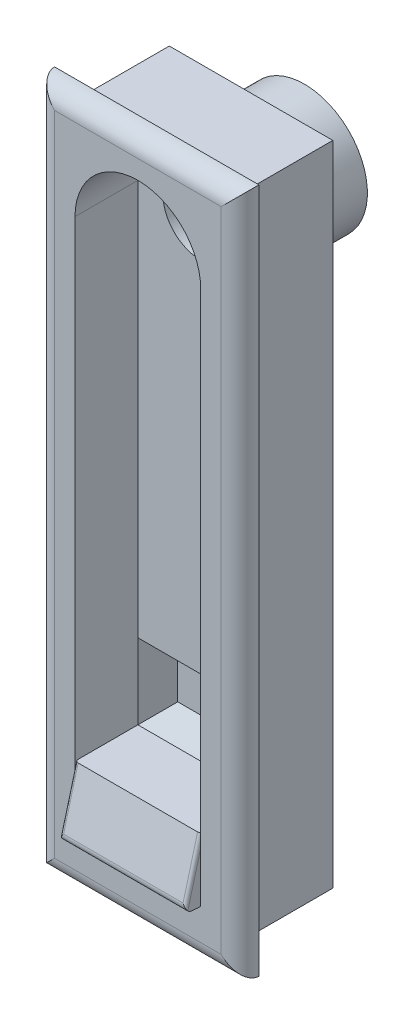
ISO-10303-21;
HEADER;
FILE_DESCRIPTION(('STEP AP214'),'2;1');
FILE_NAME('part.step','',(''),(''),'','','');
FILE_SCHEMA(('AUTOMOTIVE_DESIGN { 1 0 10303 214 1 1 1 1 }'));
ENDSEC;
DATA;
#1=APPLICATION_CONTEXT('core data for automotive mechanical design processes');
#2=APPLICATION_PROTOCOL_DEFINITION('international standard','automotive_design',2000,#1);
#3=PRODUCT_CONTEXT('',#1,'mechanical');
#4=PRODUCT('Part','Part','',(#3));
#5=PRODUCT_RELATED_PRODUCT_CATEGORY('part','',(#4));
#6=PRODUCT_DEFINITION_FORMATION('','',#4);
#7=PRODUCT_DEFINITION_CONTEXT('part definition',#1,'design');
#8=PRODUCT_DEFINITION('design','',#6,#7);
#9=PRODUCT_DEFINITION_SHAPE('','',#8);
#10=(LENGTH_UNIT() NAMED_UNIT(*) SI_UNIT(.MILLI.,.METRE.));
#11=(NAMED_UNIT(*) PLANE_ANGLE_UNIT() SI_UNIT($,.RADIAN.));
#12=(NAMED_UNIT(*) SI_UNIT($,.STERADIAN.) SOLID_ANGLE_UNIT());
#13=UNCERTAINTY_MEASURE_WITH_UNIT(LENGTH_MEASURE(1.E-05),#10,'distance_accuracy_value','');
#14=(GEOMETRIC_REPRESENTATION_CONTEXT(3) GLOBAL_UNCERTAINTY_ASSIGNED_CONTEXT((#13)) GLOBAL_UNIT_ASSIGNED_CONTEXT((#10,
#11,#12)) REPRESENTATION_CONTEXT('',''));
#15=CARTESIAN_POINT('',(0.,0.,0.));
#16=DIRECTION('',(0.,0.,1.));
#17=DIRECTION('',(1.,0.,0.));
#18=AXIS2_PLACEMENT_3D('',#15,#16,#17);
#19=CARTESIAN_POINT('',(-16.25,-54.5,3.));
#20=DIRECTION('',(0.,0.,1.));
#21=DIRECTION('',(1.,0.,0.));
#22=AXIS2_PLACEMENT_3D('',#19,#20,#21);
#23=PLANE('',#22);
#24=DIRECTION('',(0.,-1.,0.));
#25=VECTOR('',#24,1.);
#26=CARTESIAN_POINT('',(-13.25,-54.5,3.));
#27=LINE('',#26,#25);
#28=CARTESIAN_POINT('',(-13.25,51.5,3.));
#29=VERTEX_POINT('',#28);
#30=CARTESIAN_POINT('',(-13.25,-51.5,3.));
#31=VERTEX_POINT('',#30);
#32=EDGE_CURVE('E365',#29,#31,#27,.T.);
#33=ORIENTED_EDGE('',*,*,#32,.T.);
#34=DIRECTION('',(1.,0.,0.));
#35=VECTOR('',#34,1.);
#36=CARTESIAN_POINT('',(16.25,-51.5,3.));
#37=LINE('',#36,#35);
#38=CARTESIAN_POINT('',(13.25,-51.5,3.));
#39=VERTEX_POINT('',#38);
#40=EDGE_CURVE('E231',#31,#39,#37,.T.);
#41=ORIENTED_EDGE('',*,*,#40,.T.);
#42=DIRECTION('',(0.,1.,0.));
#43=VECTOR('',#42,1.);
#44=CARTESIAN_POINT('',(13.25,54.5,3.));
#45=LINE('',#44,#43);
#46=CARTESIAN_POINT('',(13.25,51.5,3.));
#47=VERTEX_POINT('',#46);
#48=EDGE_CURVE('E363',#39,#47,#45,.T.);
#49=ORIENTED_EDGE('',*,*,#48,.T.);
#50=DIRECTION('',(-1.,0.,0.));
#51=VECTOR('',#50,1.);
#52=CARTESIAN_POINT('',(-16.25,51.5,3.));
#53=LINE('',#52,#51);
#54=EDGE_CURVE('E361',#47,#29,#53,.T.);
#55=ORIENTED_EDGE('',*,*,#54,.T.);
#56=EDGE_LOOP('',(#33,#41,#49,#55));
#57=FACE_BOUND('',#56,.T.);
#58=DIRECTION('',(1.,0.,0.));
#59=VECTOR('',#58,1.);
#60=CARTESIAN_POINT('',(-9.99999999999999,-46.5,3.));
#61=LINE('',#60,#59);
#62=CARTESIAN_POINT('',(-9.99999999999999,-46.5,3.));
#63=VERTEX_POINT('',#62);
#64=CARTESIAN_POINT('',(10.,-46.5,3.));
#65=VERTEX_POINT('',#64);
#66=EDGE_CURVE('E183',#63,#65,#61,.T.);
#67=ORIENTED_EDGE('',*,*,#66,.F.);
#68=DIRECTION('',(0.,-1.,0.));
#69=VECTOR('',#68,1.);
#70=CARTESIAN_POINT('',(-9.99999999999999,-36.5,3.));
#71=LINE('',#70,#69);
#72=CARTESIAN_POINT('',(-9.99999999999999,-38.4318516525781,3.));
#73=VERTEX_POINT('',#72);
#74=EDGE_CURVE('E173',#73,#63,#71,.T.);
#75=ORIENTED_EDGE('',*,*,#74,.F.);
#76=DIRECTION('',(0.,-1.,0.));
#77=VECTOR('',#76,1.);
#78=CARTESIAN_POINT('',(-10.,38.5,3.));
#79=LINE('',#78,#77);
#80=CARTESIAN_POINT('',(-10.,38.5,3.));
#81=VERTEX_POINT('',#80);
#82=EDGE_CURVE('E285',#81,#73,#79,.T.);
#83=ORIENTED_EDGE('',*,*,#82,.F.);
#84=CARTESIAN_POINT('',(0.,38.5,3.));
#85=DIRECTION('',(0.,0.,1.));
#86=DIRECTION('',(1.,0.,0.));
#87=AXIS2_PLACEMENT_3D('',#84,#85,#86);
#88=CIRCLE('',#87,10.);
#89=CARTESIAN_POINT('',(10.,38.5,3.));
#90=VERTEX_POINT('',#89);
#91=EDGE_CURVE('E415',#90,#81,#88,.T.);
#92=ORIENTED_EDGE('',*,*,#91,.F.);
#93=DIRECTION('',(0.,1.,0.));
#94=VECTOR('',#93,1.);
#95=CARTESIAN_POINT('',(10.,38.5,3.));
#96=LINE('',#95,#94);
#97=CARTESIAN_POINT('',(10.,-38.4318516525781,3.));
#98=VERTEX_POINT('',#97);
#99=EDGE_CURVE('E50',#98,#90,#96,.T.);
#100=ORIENTED_EDGE('',*,*,#99,.F.);
#101=DIRECTION('',(0.,1.,0.));
#102=VECTOR('',#101,1.);
#103=CARTESIAN_POINT('',(10.,-36.5,3.));
#104=LINE('',#103,#102);
#105=EDGE_CURVE('E195',#65,#98,#104,.T.);
#106=ORIENTED_EDGE('',*,*,#105,.F.);
#107=EDGE_LOOP('',(#67,#75,#83,#92,#100,#106));
#108=FACE_BOUND('',#107,.T.);
#109=ADVANCED_FACE('F34',(#57,#108),#23,.T.);
#110=CARTESIAN_POINT('',(13.,-51.5,-15.));
#111=DIRECTION('',(0.,0.,-1.));
#112=DIRECTION('',(-1.,0.,0.));
#113=AXIS2_PLACEMENT_3D('',#110,#111,#112);
#114=PLANE('',#113);
#115=DIRECTION('',(0.,-1.,0.));
#116=VECTOR('',#115,1.);
#117=CARTESIAN_POINT('',(13.,51.5,-15.));
#118=LINE('',#117,#116);
#119=CARTESIAN_POINT('',(13.,51.5,-15.));
#120=VERTEX_POINT('',#119);
#121=CARTESIAN_POINT('',(13.,-51.5,-15.));
#122=VERTEX_POINT('',#121);
#123=EDGE_CURVE('E318',#120,#122,#118,.T.);
#124=ORIENTED_EDGE('',*,*,#123,.T.);
#125=DIRECTION('',(-1.,0.,0.));
#126=VECTOR('',#125,1.);
#127=CARTESIAN_POINT('',(13.,-51.5,-15.));
#128=LINE('',#127,#126);
#129=CARTESIAN_POINT('',(-13.,-51.5,-15.));
#130=VERTEX_POINT('',#129);
#131=EDGE_CURVE('E321',#122,#130,#128,.T.);
#132=ORIENTED_EDGE('',*,*,#131,.T.);
#133=DIRECTION('',(0.,1.,0.));
#134=VECTOR('',#133,1.);
#135=CARTESIAN_POINT('',(-13.,51.5,-15.));
#136=LINE('',#135,#134);
#137=CARTESIAN_POINT('',(-13.,51.5,-15.));
#138=VERTEX_POINT('',#137);
#139=EDGE_CURVE('E323',#130,#138,#136,.T.);
#140=ORIENTED_EDGE('',*,*,#139,.T.);
#141=DIRECTION('',(1.,0.,0.));
#142=VECTOR('',#141,1.);
#143=CARTESIAN_POINT('',(13.,51.5,-15.));
#144=LINE('',#143,#142);
#145=EDGE_CURVE('E325',#138,#120,#144,.T.);
#146=ORIENTED_EDGE('',*,*,#145,.T.);
#147=EDGE_LOOP('',(#124,#132,#140,#146));
#148=FACE_BOUND('',#147,.T.);
#149=CARTESIAN_POINT('',(0.,38.5,-15.));
#150=DIRECTION('',(0.,0.,-1.));
#151=DIRECTION('',(-1.,0.,0.));
#152=AXIS2_PLACEMENT_3D('',#149,#150,#151);
#153=CIRCLE('',#152,10.);
#154=CARTESIAN_POINT('',(-10.,38.5,-15.));
#155=VERTEX_POINT('',#154);
#156=EDGE_CURVE('E294',#155,#155,#153,.T.);
#157=ORIENTED_EDGE('',*,*,#156,.F.);
#158=EDGE_LOOP('',(#157));
#159=FACE_BOUND('',#158,.T.);
#160=ADVANCED_FACE('F428',(#148,#159),#114,.T.);
#161=CARTESIAN_POINT('',(-16.25,-54.5,0.));
#162=DIRECTION('',(0.,0.,1.));
#163=DIRECTION('',(1.,0.,0.));
#164=AXIS2_PLACEMENT_3D('',#161,#162,#163);
#165=PLANE('',#164);
#166=DIRECTION('',(0.,-1.,0.));
#167=VECTOR('',#166,1.);
#168=CARTESIAN_POINT('',(-16.25,54.5,0.));
#169=LINE('',#168,#167);
#170=CARTESIAN_POINT('',(-16.25,54.5,0.));
#171=VERTEX_POINT('',#170);
#172=CARTESIAN_POINT('',(-16.25,-54.5,0.));
#173=VERTEX_POINT('',#172);
#174=EDGE_CURVE('E349',#171,#173,#169,.T.);
#175=ORIENTED_EDGE('',*,*,#174,.F.);
#176=DIRECTION('',(-1.,0.,0.));
#177=VECTOR('',#176,1.);
#178=CARTESIAN_POINT('',(-16.25,54.5,0.));
#179=LINE('',#178,#177);
#180=CARTESIAN_POINT('',(16.25,54.5,0.));
#181=VERTEX_POINT('',#180);
#182=EDGE_CURVE('E358',#181,#171,#179,.T.);
#183=ORIENTED_EDGE('',*,*,#182,.F.);
#184=DIRECTION('',(0.,1.,0.));
#185=VECTOR('',#184,1.);
#186=CARTESIAN_POINT('',(16.25,54.5,0.));
#187=LINE('',#186,#185);
#188=CARTESIAN_POINT('',(16.25,-54.5,0.));
#189=VERTEX_POINT('',#188);
#190=EDGE_CURVE('E355',#189,#181,#187,.T.);
#191=ORIENTED_EDGE('',*,*,#190,.F.);
#192=DIRECTION('',(1.,0.,0.));
#193=VECTOR('',#192,1.);
#194=CARTESIAN_POINT('',(-16.25,-54.5,0.));
#195=LINE('',#194,#193);
#196=EDGE_CURVE('E352',#173,#189,#195,.T.);
#197=ORIENTED_EDGE('',*,*,#196,.F.);
#198=EDGE_LOOP('',(#175,#183,#191,#197));
#199=FACE_BOUND('',#198,.T.);
#200=DIRECTION('',(0.,-1.,0.));
#201=VECTOR('',#200,1.);
#202=CARTESIAN_POINT('',(13.,51.5,0.));
#203=LINE('',#202,#201);
#204=CARTESIAN_POINT('',(13.,51.5,0.));
#205=VERTEX_POINT('',#204);
#206=CARTESIAN_POINT('',(13.,-51.5,0.));
#207=VERTEX_POINT('',#206);
#208=EDGE_CURVE('E306',#205,#207,#203,.T.);
#209=ORIENTED_EDGE('',*,*,#208,.F.);
#210=DIRECTION('',(1.,0.,0.));
#211=VECTOR('',#210,1.);
#212=CARTESIAN_POINT('',(13.,51.5,0.));
#213=LINE('',#212,#211);
#214=CARTESIAN_POINT('',(-13.,51.5,0.));
#215=VERTEX_POINT('',#214);
#216=EDGE_CURVE('E315',#215,#205,#213,.T.);
#217=ORIENTED_EDGE('',*,*,#216,.F.);
#218=DIRECTION('',(0.,1.,0.));
#219=VECTOR('',#218,1.);
#220=CARTESIAN_POINT('',(-13.,51.5,0.));
#221=LINE('',#220,#219);
#222=CARTESIAN_POINT('',(-13.,-51.5,0.));
#223=VERTEX_POINT('',#222);
#224=EDGE_CURVE('E312',#223,#215,#221,.T.);
#225=ORIENTED_EDGE('',*,*,#224,.F.);
#226=DIRECTION('',(-1.,0.,0.));
#227=VECTOR('',#226,1.);
#228=CARTESIAN_POINT('',(13.,-51.5,0.));
#229=LINE('',#228,#227);
#230=EDGE_CURVE('E309',#207,#223,#229,.T.);
#231=ORIENTED_EDGE('',*,*,#230,.F.);
#232=EDGE_LOOP('',(#209,#217,#225,#231));
#233=FACE_BOUND('',#232,.T.);
#234=ADVANCED_FACE('F433',(#199,#233),#165,.F.);
#235=CARTESIAN_POINT('',(13.25,-54.5,0.));
#236=DIRECTION('',(0.,-1.,0.));
#237=DIRECTION('',(1.,0.,0.));
#238=AXIS2_PLACEMENT_3D('',#235,#236,#237);
#239=CYLINDRICAL_SURFACE('',#238,3.);
#240=CARTESIAN_POINT('',(13.25,-51.5,0.));
#241=DIRECTION('',(-0.707106781186547,-0.707106781186548,0.));
#242=DIRECTION('',(-0.707106781186548,0.707106781186547,0.));
#243=AXIS2_PLACEMENT_3D('',#240,#241,#242);
#244=ELLIPSE('',#243,4.24264068711928,3.);
#245=EDGE_CURVE('E343',#189,#39,#244,.T.);
#246=ORIENTED_EDGE('',*,*,#245,.F.);
#247=ORIENTED_EDGE('',*,*,#190,.T.);
#248=CARTESIAN_POINT('',(13.25,51.5,0.));
#249=DIRECTION('',(0.707106781186548,-0.707106781186547,0.));
#250=DIRECTION('',(0.707106781186547,0.707106781186548,0.));
#251=AXIS2_PLACEMENT_3D('',#248,#249,#250);
#252=ELLIPSE('',#251,4.24264068711928,3.);
#253=EDGE_CURVE('E346',#47,#181,#252,.F.);
#254=ORIENTED_EDGE('',*,*,#253,.F.);
#255=ORIENTED_EDGE('',*,*,#48,.F.);
#256=EDGE_LOOP('',(#246,#247,#254,#255));
#257=FACE_BOUND('',#256,.T.);
#258=ADVANCED_FACE('F449',(#257),#239,.T.);
#259=CARTESIAN_POINT('',(-16.25,51.5,0.));
#260=DIRECTION('',(1.,0.,0.));
#261=DIRECTION('',(0.,1.,0.));
#262=AXIS2_PLACEMENT_3D('',#259,#260,#261);
#263=CYLINDRICAL_SURFACE('',#262,3.);
#264=ORIENTED_EDGE('',*,*,#253,.T.);
#265=ORIENTED_EDGE('',*,*,#182,.T.);
#266=CARTESIAN_POINT('',(-13.25,51.5,0.));
#267=DIRECTION('',(0.707106781186547,0.707106781186548,0.));
#268=DIRECTION('',(0.707106781186548,-0.707106781186547,0.));
#269=AXIS2_PLACEMENT_3D('',#266,#267,#268);
#270=ELLIPSE('',#269,4.24264068711928,3.);
#271=EDGE_CURVE('E341',#29,#171,#270,.F.);
#272=ORIENTED_EDGE('',*,*,#271,.F.);
#273=ORIENTED_EDGE('',*,*,#54,.F.);
#274=EDGE_LOOP('',(#264,#265,#272,#273));
#275=FACE_BOUND('',#274,.T.);
#276=ADVANCED_FACE('F452',(#275),#263,.T.);
#277=CARTESIAN_POINT('',(-16.25,-51.5,0.));
#278=DIRECTION('',(-1.,0.,0.));
#279=DIRECTION('',(0.,-1.,0.));
#280=AXIS2_PLACEMENT_3D('',#277,#278,#279);
#281=CYLINDRICAL_SURFACE('',#280,3.);
#282=ORIENTED_EDGE('',*,*,#245,.T.);
#283=ORIENTED_EDGE('',*,*,#40,.F.);
#284=CARTESIAN_POINT('',(-13.25,-51.5,0.));
#285=DIRECTION('',(-0.707106781186548,0.707106781186547,0.));
#286=DIRECTION('',(-0.707106781186547,-0.707106781186548,0.));
#287=AXIS2_PLACEMENT_3D('',#284,#285,#286);
#288=ELLIPSE('',#287,4.24264068711929,3.);
#289=EDGE_CURVE('E339',#173,#31,#288,.T.);
#290=ORIENTED_EDGE('',*,*,#289,.F.);
#291=ORIENTED_EDGE('',*,*,#196,.T.);
#292=EDGE_LOOP('',(#282,#283,#290,#291));
#293=FACE_BOUND('',#292,.T.);
#294=ADVANCED_FACE('F446',(#293),#281,.T.);
#295=CARTESIAN_POINT('',(-13.25,-54.5,0.));
#296=DIRECTION('',(0.,1.,0.));
#297=DIRECTION('',(-1.,0.,0.));
#298=AXIS2_PLACEMENT_3D('',#295,#296,#297);
#299=CYLINDRICAL_SURFACE('',#298,3.);
#300=ORIENTED_EDGE('',*,*,#271,.T.);
#301=ORIENTED_EDGE('',*,*,#174,.T.);
#302=ORIENTED_EDGE('',*,*,#289,.T.);
#303=ORIENTED_EDGE('',*,*,#32,.F.);
#304=EDGE_LOOP('',(#300,#301,#302,#303));
#305=FACE_BOUND('',#304,.T.);
#306=ADVANCED_FACE('F442',(#305),#299,.T.);
#307=CARTESIAN_POINT('',(13.,51.5,-15.));
#308=DIRECTION('',(-1.,0.,0.));
#309=DIRECTION('',(0.,-1.,0.));
#310=AXIS2_PLACEMENT_3D('',#307,#308,#309);
#311=PLANE('',#310);
#312=ORIENTED_EDGE('',*,*,#208,.T.);
#313=DIRECTION('',(0.,0.,1.));
#314=VECTOR('',#313,1.);
#315=CARTESIAN_POINT('',(13.,-51.5,-15.));
#316=LINE('',#315,#314);
#317=EDGE_CURVE('E336',#122,#207,#316,.T.);
#318=ORIENTED_EDGE('',*,*,#317,.F.);
#319=ORIENTED_EDGE('',*,*,#123,.F.);
#320=DIRECTION('',(0.,0.,1.));
#321=VECTOR('',#320,1.);
#322=CARTESIAN_POINT('',(13.,51.5,-15.));
#323=LINE('',#322,#321);
#324=EDGE_CURVE('E327',#120,#205,#323,.T.);
#325=ORIENTED_EDGE('',*,*,#324,.T.);
#326=EDGE_LOOP('',(#312,#318,#319,#325));
#327=FACE_BOUND('',#326,.T.);
#328=ADVANCED_FACE('F464',(#327),#311,.F.);
#329=CARTESIAN_POINT('',(13.,-51.5,-15.));
#330=DIRECTION('',(0.,1.,0.));
#331=DIRECTION('',(0.,0.,1.));
#332=AXIS2_PLACEMENT_3D('',#329,#330,#331);
#333=PLANE('',#332);
#334=ORIENTED_EDGE('',*,*,#230,.T.);
#335=DIRECTION('',(0.,0.,1.));
#336=VECTOR('',#335,1.);
#337=CARTESIAN_POINT('',(-13.,-51.5,-15.));
#338=LINE('',#337,#336);
#339=EDGE_CURVE('E333',#130,#223,#338,.T.);
#340=ORIENTED_EDGE('',*,*,#339,.F.);
#341=ORIENTED_EDGE('',*,*,#131,.F.);
#342=ORIENTED_EDGE('',*,*,#317,.T.);
#343=EDGE_LOOP('',(#334,#340,#341,#342));
#344=FACE_BOUND('',#343,.T.);
#345=ADVANCED_FACE('F471',(#344),#333,.F.);
#346=CARTESIAN_POINT('',(-13.,51.5,-15.));
#347=DIRECTION('',(1.,0.,0.));
#348=DIRECTION('',(0.,1.,0.));
#349=AXIS2_PLACEMENT_3D('',#346,#347,#348);
#350=PLANE('',#349);
#351=ORIENTED_EDGE('',*,*,#224,.T.);
#352=DIRECTION('',(0.,0.,1.));
#353=VECTOR('',#352,1.);
#354=CARTESIAN_POINT('',(-13.,51.5,-15.));
#355=LINE('',#354,#353);
#356=EDGE_CURVE('E330',#138,#215,#355,.T.);
#357=ORIENTED_EDGE('',*,*,#356,.F.);
#358=ORIENTED_EDGE('',*,*,#139,.F.);
#359=ORIENTED_EDGE('',*,*,#339,.T.);
#360=EDGE_LOOP('',(#351,#357,#358,#359));
#361=FACE_BOUND('',#360,.T.);
#362=ADVANCED_FACE('F469',(#361),#350,.F.);
#363=CARTESIAN_POINT('',(13.,51.5,-15.));
#364=DIRECTION('',(0.,-1.,0.));
#365=DIRECTION('',(0.,0.,-1.));
#366=AXIS2_PLACEMENT_3D('',#363,#364,#365);
#367=PLANE('',#366);
#368=ORIENTED_EDGE('',*,*,#216,.T.);
#369=ORIENTED_EDGE('',*,*,#324,.F.);
#370=ORIENTED_EDGE('',*,*,#145,.F.);
#371=ORIENTED_EDGE('',*,*,#356,.T.);
#372=EDGE_LOOP('',(#368,#369,#370,#371));
#373=FACE_BOUND('',#372,.T.);
#374=ADVANCED_FACE('F460',(#373),#367,.F.);
#375=CARTESIAN_POINT('',(0.,38.5,-23.5));
#376=DIRECTION('',(0.,0.,1.));
#377=DIRECTION('',(1.,0.,0.));
#378=AXIS2_PLACEMENT_3D('',#375,#376,#377);
#379=CYLINDRICAL_SURFACE('',#378,10.);
#380=CARTESIAN_POINT('',(0.,38.5,-23.5));
#381=DIRECTION('',(0.,0.,-1.));
#382=DIRECTION('',(-1.,0.,0.));
#383=AXIS2_PLACEMENT_3D('',#380,#381,#382);
#384=CIRCLE('',#383,10.);
#385=CARTESIAN_POINT('',(-10.,38.5,-23.5));
#386=VERTEX_POINT('',#385);
#387=EDGE_CURVE('E303',#386,#386,#384,.T.);
#388=ORIENTED_EDGE('',*,*,#387,.F.);
#389=EDGE_LOOP('',(#388));
#390=FACE_BOUND('',#389,.T.);
#391=ORIENTED_EDGE('',*,*,#156,.T.);
#392=EDGE_LOOP('',(#391));
#393=FACE_BOUND('',#392,.T.);
#394=ADVANCED_FACE('F530',(#390,#393),#379,.T.);
#395=CARTESIAN_POINT('',(0.,38.5,-23.5));
#396=DIRECTION('',(0.,0.,-1.));
#397=DIRECTION('',(-1.,0.,0.));
#398=AXIS2_PLACEMENT_3D('',#395,#396,#397);
#399=PLANE('',#398);
#400=CARTESIAN_POINT('',(0.,38.5,-23.5));
#401=DIRECTION('',(0.,0.,-1.));
#402=DIRECTION('',(-1.,0.,0.));
#403=AXIS2_PLACEMENT_3D('',#400,#401,#402);
#404=CIRCLE('',#403,6.);
#405=CARTESIAN_POINT('',(-6.,38.5,-23.5));
#406=VERTEX_POINT('',#405);
#407=EDGE_CURVE('E717',#406,#406,#404,.T.);
#408=ORIENTED_EDGE('',*,*,#407,.F.);
#409=EDGE_LOOP('',(#408));
#410=FACE_BOUND('',#409,.T.);
#411=ORIENTED_EDGE('',*,*,#387,.T.);
#412=EDGE_LOOP('',(#411));
#413=FACE_BOUND('',#412,.T.);
#414=ADVANCED_FACE('F544',(#410,#413),#399,.T.);
#415=CARTESIAN_POINT('',(10.,38.5,-7.));
#416=DIRECTION('',(1.,0.,0.));
#417=DIRECTION('',(0.,1.,0.));
#418=AXIS2_PLACEMENT_3D('',#415,#416,#417);
#419=PLANE('',#418);
#420=ORIENTED_EDGE('',*,*,#99,.T.);
#421=DIRECTION('',(0.,0.,1.));
#422=VECTOR('',#421,1.);
#423=CARTESIAN_POINT('',(10.,38.5,-7.));
#424=LINE('',#423,#422);
#425=CARTESIAN_POINT('',(10.,38.5,-7.));
#426=VERTEX_POINT('',#425);
#427=EDGE_CURVE('E296',#426,#90,#424,.T.);
#428=ORIENTED_EDGE('',*,*,#427,.F.);
#429=DIRECTION('',(0.,1.,0.));
#430=VECTOR('',#429,1.);
#431=CARTESIAN_POINT('',(10.,38.5,-7.));
#432=LINE('',#431,#430);
#433=CARTESIAN_POINT('',(10.,-24.5,-7.));
#434=VERTEX_POINT('',#433);
#435=EDGE_CURVE('E369',#434,#426,#432,.T.);
#436=ORIENTED_EDGE('',*,*,#435,.F.);
#437=CARTESIAN_POINT('',(10.,-36.5,-7.));
#438=VERTEX_POINT('',#437);
#439=EDGE_CURVE('E371',#438,#434,#432,.T.);
#440=ORIENTED_EDGE('',*,*,#439,.F.);
#441=DIRECTION('',(0.,0.,1.));
#442=VECTOR('',#441,1.);
#443=CARTESIAN_POINT('',(10.,-36.5,-7.));
#444=LINE('',#443,#442);
#445=CARTESIAN_POINT('',(10.,-36.5,2.48236190979496));
#446=VERTEX_POINT('',#445);
#447=EDGE_CURVE('E258',#438,#446,#444,.T.);
#448=ORIENTED_EDGE('',*,*,#447,.T.);
#449=DIRECTION('',(0.,-0.965925826289068,0.258819045102521));
#450=VECTOR('',#449,1.);
#451=CARTESIAN_POINT('',(10.,-37.4659258262891,2.74118095489748));
#452=LINE('',#451,#450);
#453=EDGE_CURVE('E43',#446,#98,#452,.T.);
#454=ORIENTED_EDGE('',*,*,#453,.T.);
#455=EDGE_LOOP('',(#420,#428,#436,#440,#448,#454));
#456=FACE_BOUND('',#455,.T.);
#457=ADVANCED_FACE('F253',(#456),#419,.F.);
#458=CARTESIAN_POINT('',(-9.99999999999999,-36.5,-7.));
#459=DIRECTION('',(0.,-1.,0.));
#460=DIRECTION('',(0.,0.,-1.));
#461=AXIS2_PLACEMENT_3D('',#458,#459,#460);
#462=PLANE('',#461);
#463=DIRECTION('',(1.,0.,0.));
#464=VECTOR('',#463,1.);
#465=CARTESIAN_POINT('',(-9.99999999999999,-36.5,3.));
#466=LINE('',#465,#464);
#467=CARTESIAN_POINT('',(-9.49999999999999,-36.5,3.));
#468=VERTEX_POINT('',#467);
#469=CARTESIAN_POINT('',(9.50000000000001,-36.5,3.));
#470=VERTEX_POINT('',#469);
#471=EDGE_CURVE('E372',#468,#470,#466,.T.);
#472=ORIENTED_EDGE('',*,*,#471,.T.);
#473=CARTESIAN_POINT('',(9.50000000000001,-36.5,2.48236190979496));
#474=DIRECTION('',(0.,-1.,0.));
#475=DIRECTION('',(0.,0.,1.));
#476=AXIS2_PLACEMENT_3D('',#473,#474,#475);
#477=ELLIPSE('',#476,0.517638090205042,0.5);
#478=EDGE_CURVE('E238',#470,#446,#477,.F.);
#479=ORIENTED_EDGE('',*,*,#478,.T.);
#480=ORIENTED_EDGE('',*,*,#447,.F.);
#481=DIRECTION('',(1.,0.,0.));
#482=VECTOR('',#481,1.);
#483=CARTESIAN_POINT('',(-9.99999999999999,-36.5,-7.));
#484=LINE('',#483,#482);
#485=CARTESIAN_POINT('',(-9.99999999999999,-36.5,-7.));
#486=VERTEX_POINT('',#485);
#487=EDGE_CURVE('E291',#486,#438,#484,.T.);
#488=ORIENTED_EDGE('',*,*,#487,.F.);
#489=DIRECTION('',(0.,0.,1.));
#490=VECTOR('',#489,1.);
#491=CARTESIAN_POINT('',(-9.99999999999999,-36.5,-7.));
#492=LINE('',#491,#490);
#493=CARTESIAN_POINT('',(-9.99999999999999,-36.5,2.48236190979496));
#494=VERTEX_POINT('',#493);
#495=EDGE_CURVE('E283',#486,#494,#492,.T.);
#496=ORIENTED_EDGE('',*,*,#495,.T.);
#497=CARTESIAN_POINT('',(-9.49999999999999,-36.5,2.48236190979496));
#498=DIRECTION('',(0.,-1.,0.));
#499=DIRECTION('',(0.,0.,-1.));
#500=AXIS2_PLACEMENT_3D('',#497,#498,#499);
#501=ELLIPSE('',#500,0.517638090205042,0.5);
#502=EDGE_CURVE('E236',#494,#468,#501,.F.);
#503=ORIENTED_EDGE('',*,*,#502,.T.);
#504=EDGE_LOOP('',(#472,#479,#480,#488,#496,#503));
#505=FACE_BOUND('',#504,.T.);
#506=ADVANCED_FACE('F288',(#505),#462,.F.);
#507=CARTESIAN_POINT('',(-10.,38.5,-7.));
#508=DIRECTION('',(-1.,0.,0.));
#509=DIRECTION('',(0.,-1.,0.));
#510=AXIS2_PLACEMENT_3D('',#507,#508,#509);
#511=PLANE('',#510);
#512=ORIENTED_EDGE('',*,*,#82,.T.);
#513=DIRECTION('',(0.,0.965925826289068,-0.258819045102521));
#514=VECTOR('',#513,1.);
#515=CARTESIAN_POINT('',(-9.99999999999999,-37.4659258262891,2.74118095489748));
#516=LINE('',#515,#514);
#517=EDGE_CURVE('E12',#73,#494,#516,.T.);
#518=ORIENTED_EDGE('',*,*,#517,.T.);
#519=ORIENTED_EDGE('',*,*,#495,.F.);
#520=DIRECTION('',(0.,-1.,0.));
#521=VECTOR('',#520,1.);
#522=CARTESIAN_POINT('',(-9.99999999999999,-36.5,-7.));
#523=LINE('',#522,#521);
#524=CARTESIAN_POINT('',(-9.99999999999999,-24.5,-7.));
#525=VERTEX_POINT('',#524);
#526=EDGE_CURVE('E192',#525,#486,#523,.T.);
#527=ORIENTED_EDGE('',*,*,#526,.F.);
#528=DIRECTION('',(0.,-1.,0.));
#529=VECTOR('',#528,1.);
#530=CARTESIAN_POINT('',(-10.,38.5,-7.));
#531=LINE('',#530,#529);
#532=CARTESIAN_POINT('',(-10.,38.5,-7.));
#533=VERTEX_POINT('',#532);
#534=EDGE_CURVE('E211',#533,#525,#531,.T.);
#535=ORIENTED_EDGE('',*,*,#534,.F.);
#536=DIRECTION('',(0.,0.,1.));
#537=VECTOR('',#536,1.);
#538=CARTESIAN_POINT('',(-10.,38.5,-7.));
#539=LINE('',#538,#537);
#540=EDGE_CURVE('E292',#533,#81,#539,.T.);
#541=ORIENTED_EDGE('',*,*,#540,.T.);
#542=EDGE_LOOP('',(#512,#518,#519,#527,#535,#541));
#543=FACE_BOUND('',#542,.T.);
#544=ADVANCED_FACE('F281',(#543),#511,.F.);
#545=CARTESIAN_POINT('',(0.,38.5,-7.));
#546=DIRECTION('',(0.,0.,1.));
#547=DIRECTION('',(1.,0.,0.));
#548=AXIS2_PLACEMENT_3D('',#545,#546,#547);
#549=CYLINDRICAL_SURFACE('',#548,10.);
#550=ORIENTED_EDGE('',*,*,#91,.T.);
#551=ORIENTED_EDGE('',*,*,#540,.F.);
#552=CARTESIAN_POINT('',(0.,38.5,-7.));
#553=DIRECTION('',(0.,0.,1.));
#554=DIRECTION('',(1.,0.,0.));
#555=AXIS2_PLACEMENT_3D('',#552,#553,#554);
#556=CIRCLE('',#555,10.);
#557=EDGE_CURVE('E377',#426,#533,#556,.T.);
#558=ORIENTED_EDGE('',*,*,#557,.F.);
#559=ORIENTED_EDGE('',*,*,#427,.T.);
#560=EDGE_LOOP('',(#550,#551,#558,#559));
#561=FACE_BOUND('',#560,.T.);
#562=ADVANCED_FACE('F552',(#561),#549,.F.);
#563=CARTESIAN_POINT('',(0.,38.5,-7.));
#564=DIRECTION('',(0.,0.,1.));
#565=DIRECTION('',(1.,0.,0.));
#566=AXIS2_PLACEMENT_3D('',#563,#564,#565);
#567=PLANE('',#566);
#568=CARTESIAN_POINT('',(0.,38.5,-7.));
#569=DIRECTION('',(0.,0.,1.));
#570=DIRECTION('',(1.,0.,0.));
#571=AXIS2_PLACEMENT_3D('',#568,#569,#570);
#572=CIRCLE('',#571,6.);
#573=CARTESIAN_POINT('',(6.,38.5,-7.));
#574=VERTEX_POINT('',#573);
#575=EDGE_CURVE('E37',#574,#574,#572,.T.);
#576=ORIENTED_EDGE('',*,*,#575,.F.);
#577=EDGE_LOOP('',(#576));
#578=FACE_BOUND('',#577,.T.);
#579=DIRECTION('',(-1.,0.,0.));
#580=VECTOR('',#579,1.);
#581=CARTESIAN_POINT('',(-9.99999999999999,-24.5,-7.));
#582=LINE('',#581,#580);
#583=EDGE_CURVE('E206',#434,#525,#582,.T.);
#584=ORIENTED_EDGE('',*,*,#583,.F.);
#585=ORIENTED_EDGE('',*,*,#435,.T.);
#586=ORIENTED_EDGE('',*,*,#557,.T.);
#587=ORIENTED_EDGE('',*,*,#534,.T.);
#588=EDGE_LOOP('',(#584,#585,#586,#587));
#589=FACE_BOUND('',#588,.T.);
#590=ADVANCED_FACE('F386',(#578,#589),#567,.T.);
#591=CARTESIAN_POINT('',(-9.99999999999999,-36.5,-7.));
#592=DIRECTION('',(-0.965925826289068,0.,-0.258819045102521));
#593=DIRECTION('',(-0.258819045102521,0.,0.965925826289068));
#594=AXIS2_PLACEMENT_3D('',#591,#592,#593);
#595=PLANE('',#594);
#596=ORIENTED_EDGE('',*,*,#526,.T.);
#597=DIRECTION('',(-0.250562807085732,-0.250562807085732,0.935113126531029));
#598=VECTOR('',#597,1.);
#599=CARTESIAN_POINT('',(-9.99999999999999,-36.5,-7.));
#600=LINE('',#599,#598);
#601=CARTESIAN_POINT('',(-8.66025403784437,-35.1602540378444,-12.));
#602=VERTEX_POINT('',#601);
#603=EDGE_CURVE('E203',#602,#486,#600,.T.);
#604=ORIENTED_EDGE('',*,*,#603,.F.);
#605=DIRECTION('',(0.,-1.,0.));
#606=VECTOR('',#605,1.);
#607=CARTESIAN_POINT('',(-8.66025403784437,-36.5,-12.));
#608=LINE('',#607,#606);
#609=CARTESIAN_POINT('',(-8.66025403784437,-25.8397459621556,-12.));
#610=VERTEX_POINT('',#609);
#611=EDGE_CURVE('E210',#610,#602,#608,.T.);
#612=ORIENTED_EDGE('',*,*,#611,.F.);
#613=DIRECTION('',(-0.250562807085732,0.250562807085732,0.935113126531029));
#614=VECTOR('',#613,1.);
#615=CARTESIAN_POINT('',(-9.99999999999999,-24.5,-7.));
#616=LINE('',#615,#614);
#617=EDGE_CURVE('E217',#610,#525,#616,.T.);
#618=ORIENTED_EDGE('',*,*,#617,.T.);
#619=EDGE_LOOP('',(#596,#604,#612,#618));
#620=FACE_BOUND('',#619,.T.);
#621=ADVANCED_FACE('F391',(#620),#595,.F.);
#622=CARTESIAN_POINT('',(-9.99999999999999,-24.5,-7.));
#623=DIRECTION('',(0.,0.965925826289068,-0.258819045102521));
#624=DIRECTION('',(0.,0.258819045102521,0.965925826289068));
#625=AXIS2_PLACEMENT_3D('',#622,#623,#624);
#626=PLANE('',#625);
#627=ORIENTED_EDGE('',*,*,#583,.T.);
#628=ORIENTED_EDGE('',*,*,#617,.F.);
#629=DIRECTION('',(-1.,0.,0.));
#630=VECTOR('',#629,1.);
#631=CARTESIAN_POINT('',(-9.99999999999999,-25.8397459621556,-12.));
#632=LINE('',#631,#630);
#633=CARTESIAN_POINT('',(8.66025403784439,-25.8397459621556,-12.));
#634=VERTEX_POINT('',#633);
#635=EDGE_CURVE('E399',#634,#610,#632,.T.);
#636=ORIENTED_EDGE('',*,*,#635,.F.);
#637=DIRECTION('',(0.250562807085732,0.250562807085732,0.935113126531029));
#638=VECTOR('',#637,1.);
#639=CARTESIAN_POINT('',(9.24661935646383,-25.2533806435362,-9.81165483911596));
#640=LINE('',#639,#638);
#641=EDGE_CURVE('E214',#634,#434,#640,.T.);
#642=ORIENTED_EDGE('',*,*,#641,.T.);
#643=EDGE_LOOP('',(#627,#628,#636,#642));
#644=FACE_BOUND('',#643,.T.);
#645=ADVANCED_FACE('F398',(#644),#626,.F.);
#646=CARTESIAN_POINT('',(10.,-36.5,-7.));
#647=DIRECTION('',(0.965925826289068,0.,-0.258819045102521));
#648=DIRECTION('',(-0.258819045102521,0.,-0.965925826289068));
#649=AXIS2_PLACEMENT_3D('',#646,#647,#648);
#650=PLANE('',#649);
#651=ORIENTED_EDGE('',*,*,#439,.T.);
#652=ORIENTED_EDGE('',*,*,#641,.F.);
#653=DIRECTION('',(0.,1.,0.));
#654=VECTOR('',#653,1.);
#655=CARTESIAN_POINT('',(8.66025403784439,-36.5,-12.));
#656=LINE('',#655,#654);
#657=CARTESIAN_POINT('',(8.66025403784439,-35.1602540378444,-12.));
#658=VERTEX_POINT('',#657);
#659=EDGE_CURVE('E404',#658,#634,#656,.T.);
#660=ORIENTED_EDGE('',*,*,#659,.F.);
#661=DIRECTION('',(0.250562807085732,-0.250562807085732,0.935113126531029));
#662=VECTOR('',#661,1.);
#663=CARTESIAN_POINT('',(8.74436559410637,-35.2443655941064,-11.6860913985266));
#664=LINE('',#663,#662);
#665=EDGE_CURVE('E218',#658,#438,#664,.T.);
#666=ORIENTED_EDGE('',*,*,#665,.T.);
#667=EDGE_LOOP('',(#651,#652,#660,#666));
#668=FACE_BOUND('',#667,.T.);
#669=ADVANCED_FACE('F403',(#668),#650,.F.);
#670=CARTESIAN_POINT('',(-9.99999999999999,-36.5,-7.));
#671=DIRECTION('',(0.,-0.965925826289068,-0.258819045102521));
#672=DIRECTION('',(0.,0.258819045102521,-0.965925826289068));
#673=AXIS2_PLACEMENT_3D('',#670,#671,#672);
#674=PLANE('',#673);
#675=ORIENTED_EDGE('',*,*,#487,.T.);
#676=ORIENTED_EDGE('',*,*,#665,.F.);
#677=DIRECTION('',(1.,0.,0.));
#678=VECTOR('',#677,1.);
#679=CARTESIAN_POINT('',(-9.99999999999999,-35.1602540378444,-12.));
#680=LINE('',#679,#678);
#681=EDGE_CURVE('E408',#602,#658,#680,.T.);
#682=ORIENTED_EDGE('',*,*,#681,.F.);
#683=ORIENTED_EDGE('',*,*,#603,.T.);
#684=EDGE_LOOP('',(#675,#676,#682,#683));
#685=FACE_BOUND('',#684,.T.);
#686=ADVANCED_FACE('F586',(#685),#674,.F.);
#687=CARTESIAN_POINT('',(-9.99999999999999,-24.5,-12.));
#688=DIRECTION('',(0.,0.,-1.));
#689=DIRECTION('',(-1.,0.,0.));
#690=AXIS2_PLACEMENT_3D('',#687,#688,#689);
#691=PLANE('',#690);
#692=ORIENTED_EDGE('',*,*,#611,.T.);
#693=ORIENTED_EDGE('',*,*,#681,.T.);
#694=ORIENTED_EDGE('',*,*,#659,.T.);
#695=ORIENTED_EDGE('',*,*,#635,.T.);
#696=EDGE_LOOP('',(#692,#693,#694,#695));
#697=FACE_BOUND('',#696,.T.);
#698=ADVANCED_FACE('F407',(#697),#691,.F.);
#699=CARTESIAN_POINT('',(-9.99999999999999,-36.5,3.));
#700=DIRECTION('',(1.,0.,0.));
#701=DIRECTION('',(0.,0.,-1.));
#702=AXIS2_PLACEMENT_3D('',#699,#700,#701);
#703=PLANE('',#702);
#704=CARTESIAN_POINT('',(-9.99999999999999,-45.3983222803226,4.34902208859422));
#705=DIRECTION('',(1.,0.,0.));
#706=DIRECTION('',(0.,0.,-1.));
#707=AXIS2_PLACEMENT_3D('',#704,#705,#706);
#708=CIRCLE('',#707,1.);
#709=CARTESIAN_POINT('',(-9.99999999999999,-46.387024755914,4.49891343177136));
#710=VERTEX_POINT('',#709);
#711=CARTESIAN_POINT('',(-9.99999999999999,-46.1054290615094,5.05612886978085));
#712=VERTEX_POINT('',#711);
#713=EDGE_CURVE('E244',#710,#712,#708,.F.);
#714=ORIENTED_EDGE('',*,*,#713,.T.);
#715=DIRECTION('',(0.,-0.965925826289068,0.258819045102521));
#716=VECTOR('',#715,1.);
#717=CARTESIAN_POINT('',(-9.99999999999999,-36.6294095225513,2.51703708685547));
#718=LINE('',#717,#716);
#719=EDGE_CURVE('E179',#712,#73,#718,.F.);
#720=ORIENTED_EDGE('',*,*,#719,.T.);
#721=ORIENTED_EDGE('',*,*,#74,.T.);
#722=CARTESIAN_POINT('',(-9.99999999999999,-36.5,3.));
#723=DIRECTION('',(1.,0.,0.));
#724=DIRECTION('',(0.,0.,-1.));
#725=AXIS2_PLACEMENT_3D('',#722,#723,#724);
#726=CIRCLE('',#725,10.);
#727=EDGE_CURVE('E176',#710,#63,#726,.T.);
#728=ORIENTED_EDGE('',*,*,#727,.F.);
#729=EDGE_LOOP('',(#714,#720,#721,#728));
#730=FACE_BOUND('',#729,.T.);
#731=ADVANCED_FACE('F175',(#730),#703,.F.);
#732=CARTESIAN_POINT('',(-9.99999999999999,-36.5,3.));
#733=DIRECTION('',(1.,0.,0.));
#734=DIRECTION('',(0.,0.,-1.));
#735=AXIS2_PLACEMENT_3D('',#732,#733,#734);
#736=CYLINDRICAL_SURFACE('',#735,10.);
#737=CARTESIAN_POINT('',(10.,-36.5,3.));
#738=DIRECTION('',(1.,0.,0.));
#739=DIRECTION('',(0.,0.,-1.));
#740=AXIS2_PLACEMENT_3D('',#737,#738,#739);
#741=CIRCLE('',#740,10.);
#742=CARTESIAN_POINT('',(10.,-46.387024755914,4.49891343177136));
#743=VERTEX_POINT('',#742);
#744=EDGE_CURVE('E193',#743,#65,#741,.T.);
#745=ORIENTED_EDGE('',*,*,#744,.F.);
#746=DIRECTION('',(1.,0.,0.));
#747=VECTOR('',#746,1.);
#748=CARTESIAN_POINT('',(-9.99999999999999,-46.387024755914,4.49891343177136));
#749=LINE('',#748,#747);
#750=EDGE_CURVE('E191',#743,#710,#749,.F.);
#751=ORIENTED_EDGE('',*,*,#750,.T.);
#752=ORIENTED_EDGE('',*,*,#727,.T.);
#753=ORIENTED_EDGE('',*,*,#66,.T.);
#754=EDGE_LOOP('',(#745,#751,#752,#753));
#755=FACE_BOUND('',#754,.T.);
#756=ADVANCED_FACE('F189',(#755),#736,.T.);
#757=CARTESIAN_POINT('',(10.,-36.5,3.));
#758=DIRECTION('',(-1.,0.,0.));
#759=DIRECTION('',(0.,0.,1.));
#760=AXIS2_PLACEMENT_3D('',#757,#758,#759);
#761=PLANE('',#760);
#762=ORIENTED_EDGE('',*,*,#105,.T.);
#763=DIRECTION('',(0.,0.965925826289068,-0.258819045102521));
#764=VECTOR('',#763,1.);
#765=CARTESIAN_POINT('',(10.,-46.2886677854419,5.10522753788068));
#766=LINE('',#765,#764);
#767=CARTESIAN_POINT('',(10.,-46.1054290615094,5.05612886978085));
#768=VERTEX_POINT('',#767);
#769=EDGE_CURVE('E242',#98,#768,#766,.F.);
#770=ORIENTED_EDGE('',*,*,#769,.T.);
#771=CARTESIAN_POINT('',(10.,-45.3983222803226,4.34902208859422));
#772=DIRECTION('',(-1.,0.,0.));
#773=DIRECTION('',(0.,0.,1.));
#774=AXIS2_PLACEMENT_3D('',#771,#772,#773);
#775=CIRCLE('',#774,1.);
#776=EDGE_CURVE('E240',#768,#743,#775,.F.);
#777=ORIENTED_EDGE('',*,*,#776,.T.);
#778=ORIENTED_EDGE('',*,*,#744,.T.);
#779=EDGE_LOOP('',(#762,#770,#777,#778));
#780=FACE_BOUND('',#779,.T.);
#781=ADVANCED_FACE('F267',(#780),#761,.F.);
#782=CARTESIAN_POINT('',(-9.99999999999999,-46.1592582628907,5.58819045102522));
#783=DIRECTION('',(0.,0.258819045102521,0.965925826289068));
#784=DIRECTION('',(1.,0.,0.));
#785=AXIS2_PLACEMENT_3D('',#782,#783,#784);
#786=PLANE('',#785);
#787=DIRECTION('',(-1.,0.,0.));
#788=VECTOR('',#787,1.);
#789=CARTESIAN_POINT('',(10.,-45.13950323522,5.31494791488329));
#790=LINE('',#789,#788);
#791=CARTESIAN_POINT('',(-9.49999999999999,-45.13950323522,5.31494791488329));
#792=VERTEX_POINT('',#791);
#793=CARTESIAN_POINT('',(9.50000000000001,-45.13950323522,5.31494791488329));
#794=VERTEX_POINT('',#793);
#795=EDGE_CURVE('E228',#792,#794,#790,.F.);
#796=ORIENTED_EDGE('',*,*,#795,.T.);
#797=DIRECTION('',(0.,0.965925826289068,-0.258819045102521));
#798=VECTOR('',#797,1.);
#799=CARTESIAN_POINT('',(9.50000000000001,-36.5,3.));
#800=LINE('',#799,#798);
#801=EDGE_CURVE('E233',#794,#470,#800,.T.);
#802=ORIENTED_EDGE('',*,*,#801,.T.);
#803=ORIENTED_EDGE('',*,*,#471,.F.);
#804=DIRECTION('',(0.,-0.965925826289068,0.258819045102521));
#805=VECTOR('',#804,1.);
#806=CARTESIAN_POINT('',(-9.49999999999999,-46.1592582628907,5.58819045102522));
#807=LINE('',#806,#805);
#808=EDGE_CURVE('E230',#468,#792,#807,.T.);
#809=ORIENTED_EDGE('',*,*,#808,.T.);
#810=EDGE_LOOP('',(#796,#802,#803,#809));
#811=FACE_BOUND('',#810,.T.);
#812=ADVANCED_FACE('F417',(#811),#786,.T.);
#813=CARTESIAN_POINT('',(-9.49999999999999,-46.2886677854419,5.10522753788068));
#814=DIRECTION('',(0.,0.965925826289068,-0.258819045102521));
#815=DIRECTION('',(0.,0.258819045102521,0.965925826289068));
#816=AXIS2_PLACEMENT_3D('',#813,#814,#815);
#817=CYLINDRICAL_SURFACE('',#816,0.5);
#818=ORIENTED_EDGE('',*,*,#517,.F.);
#819=ORIENTED_EDGE('',*,*,#719,.F.);
#820=CARTESIAN_POINT('',(-9.99999999999999,-46.1054290615094,5.05612886978085));
#821=CARTESIAN_POINT('',(-9.99999927190715,-46.0901390917954,5.07142588834119));
#822=CARTESIAN_POINT('',(-9.99894798687574,-46.0743688198302,5.08619652370505));
#823=CARTESIAN_POINT('',(-9.9949936977232,-46.0420805039044,5.11455035257201));
#824=CARTESIAN_POINT('',(-9.99209538591282,-46.0255644530772,5.12813645619643));
#825=CARTESIAN_POINT('',(-9.98109578787941,-45.9755613937886,5.16666994681129));
#826=CARTESIAN_POINT('',(-9.97067561405563,-45.9411870909114,5.18982021720765));
#827=CARTESIAN_POINT('',(-9.94287002500584,-45.8645420416769,5.23501595770561));
#828=CARTESIAN_POINT('',(-9.92453561172092,-45.8220149445759,5.256009938137));
#829=CARTESIAN_POINT('',(-9.8834099518978,-45.7361188354203,5.29139474287834));
#830=CARTESIAN_POINT('',(-9.86059237085418,-45.6927462831553,5.30574478205675));
#831=CARTESIAN_POINT('',(-9.80216549771063,-45.5884797433315,5.33279203058312));
#832=CARTESIAN_POINT('',(-9.76512017017139,-45.5276098005591,5.34246152488902));
#833=CARTESIAN_POINT('',(-9.6880100793128,-45.4072989378904,5.35079768227751));
#834=CARTESIAN_POINT('',(-9.6479493318008,-45.3478562517477,5.34947873110818));
#835=CARTESIAN_POINT('',(-9.57300988111013,-45.2403172783226,5.33769325127557));
#836=CARTESIAN_POINT('',(-9.5383225565869,-45.1919222340095,5.3287177517739));
#837=CARTESIAN_POINT('',(-9.50243429016673,-45.1428296898731,5.3158346294261));
#838=CARTESIAN_POINT('',(-9.50121712474537,-45.1411658609656,5.31539340827708));
#839=CARTESIAN_POINT('',(-9.49999999999999,-45.13950323522,5.31494791488329));
#840=B_SPLINE_CURVE_WITH_KNOTS('',3,(#820,#821,#822,#823,#824,#825,#826,#827,#828,#829,#830,
#831,#832,#833,#834,#835,#836,#837,#838,#839),.UNSPECIFIED.,.F.,.F.,(4,2,2,2,2,2,2,2,2,4),(0.,
0.0647962104610702,0.129428460958956,0.256901938025759,0.408670619383787,0.561358997503349,
0.775938521386539,0.990237168286523,1.17039020787357,1.17671477724875),.UNSPECIFIED.);
#841=EDGE_CURVE('E184',#792,#712,#840,.F.);
#842=ORIENTED_EDGE('',*,*,#841,.F.);
#843=ORIENTED_EDGE('',*,*,#808,.F.);
#844=ORIENTED_EDGE('',*,*,#502,.F.);
#845=EDGE_LOOP('',(#818,#819,#842,#843,#844));
#846=FACE_BOUND('',#845,.T.);
#847=ADVANCED_FACE('F274',(#846),#817,.T.);
#848=CARTESIAN_POINT('',(-9.99999999999999,-45.3983222803226,4.34902208859422));
#849=DIRECTION('',(1.,0.,0.));
#850=DIRECTION('',(0.,0.,-1.));
#851=AXIS2_PLACEMENT_3D('',#848,#849,#850);
#852=CYLINDRICAL_SURFACE('',#851,1.);
#853=ORIENTED_EDGE('',*,*,#750,.F.);
#854=ORIENTED_EDGE('',*,*,#776,.F.);
#855=CARTESIAN_POINT('',(10.,-46.1054290615094,5.05612886978085));
#856=CARTESIAN_POINT('',(9.99999927190718,-46.0901390917954,5.07142588834119));
#857=CARTESIAN_POINT('',(9.99894798687577,-46.0743688198302,5.08619652370505));
#858=CARTESIAN_POINT('',(9.99499369772322,-46.0420805039044,5.11455035257201));
#859=CARTESIAN_POINT('',(9.99209538591284,-46.0255644530772,5.12813645619643));
#860=CARTESIAN_POINT('',(9.98109578787943,-45.9755613937886,5.16666994681129));
#861=CARTESIAN_POINT('',(9.97067561405565,-45.9411870909114,5.18982021720765));
#862=CARTESIAN_POINT('',(9.94287002500587,-45.8645420416769,5.23501595770561));
#863=CARTESIAN_POINT('',(9.92453561172094,-45.8220149445759,5.256009938137));
#864=CARTESIAN_POINT('',(9.88340995189783,-45.7361188354203,5.29139474287834));
#865=CARTESIAN_POINT('',(9.86059237085421,-45.6927462831553,5.30574478205675));
#866=CARTESIAN_POINT('',(9.80216549771066,-45.5884797433315,5.33279203058312));
#867=CARTESIAN_POINT('',(9.76512017017141,-45.5276098005591,5.34246152488902));
#868=CARTESIAN_POINT('',(9.68801007931283,-45.4072989378904,5.35079768227751));
#869=CARTESIAN_POINT('',(9.64794933180082,-45.3478562517477,5.34947873110818));
#870=CARTESIAN_POINT('',(9.57300988111015,-45.2403172783226,5.33769325127557));
#871=CARTESIAN_POINT('',(9.53832255658692,-45.1919222340095,5.3287177517739));
#872=CARTESIAN_POINT('',(9.50243429016675,-45.1428296898731,5.3158346294261));
#873=CARTESIAN_POINT('',(9.50121712474539,-45.1411658609656,5.31539340827708));
#874=CARTESIAN_POINT('',(9.50000000000001,-45.13950323522,5.31494791488329));
#875=B_SPLINE_CURVE_WITH_KNOTS('',3,(#855,#856,#857,#858,#859,#860,#861,#862,#863,#864,#865,
#866,#867,#868,#869,#870,#871,#872,#873,#874),.UNSPECIFIED.,.F.,.F.,(4,2,2,2,2,2,2,2,2,4),(0.,
0.0647962104610702,0.129428460958956,0.256901938025759,0.408670619383787,0.561358997503349,
0.775938521386539,0.990237168286523,1.17039020787357,1.17671477724875),.UNSPECIFIED.);
#876=EDGE_CURVE('E264',#794,#768,#875,.F.);
#877=ORIENTED_EDGE('',*,*,#876,.F.);
#878=ORIENTED_EDGE('',*,*,#795,.F.);
#879=ORIENTED_EDGE('',*,*,#841,.T.);
#880=ORIENTED_EDGE('',*,*,#713,.F.);
#881=EDGE_LOOP('',(#853,#854,#877,#878,#879,#880));
#882=FACE_BOUND('',#881,.T.);
#883=ADVANCED_FACE('F269',(#882),#852,.T.);
#884=CARTESIAN_POINT('',(9.50000000000001,-46.2886677854419,5.10522753788068));
#885=DIRECTION('',(0.,-0.965925826289068,0.258819045102521));
#886=DIRECTION('',(0.,-0.258819045102521,-0.965925826289068));
#887=AXIS2_PLACEMENT_3D('',#884,#885,#886);
#888=CYLINDRICAL_SURFACE('',#887,0.5);
#889=ORIENTED_EDGE('',*,*,#876,.T.);
#890=ORIENTED_EDGE('',*,*,#769,.F.);
#891=ORIENTED_EDGE('',*,*,#453,.F.);
#892=ORIENTED_EDGE('',*,*,#478,.F.);
#893=ORIENTED_EDGE('',*,*,#801,.F.);
#894=EDGE_LOOP('',(#889,#890,#891,#892,#893));
#895=FACE_BOUND('',#894,.T.);
#896=ADVANCED_FACE('F261',(#895),#888,.T.);
#897=CARTESIAN_POINT('',(0.,38.5,5.34902208859422));
#898=DIRECTION('',(0.,0.,-1.));
#899=DIRECTION('',(-1.,0.,0.));
#900=AXIS2_PLACEMENT_3D('',#897,#898,#899);
#901=CYLINDRICAL_SURFACE('',#900,6.);
#902=ORIENTED_EDGE('',*,*,#575,.T.);
#903=EDGE_LOOP('',(#902));
#904=FACE_BOUND('',#903,.T.);
#905=ORIENTED_EDGE('',*,*,#407,.T.);
#906=EDGE_LOOP('',(#905));
#907=FACE_BOUND('',#906,.T.);
#908=ADVANCED_FACE('F676',(#904,#907),#901,.F.);
#909=CLOSED_SHELL('',(#109,#160,#234,#258,#276,#294,#306,#328,#345,#362,#374,#394,#414,#457,
#506,#544,#562,#590,#621,#645,#669,#686,#698,#731,#756,#781,#812,#847,#883,#896,#908));
#910=MANIFOLD_SOLID_BREP('B2',#909);
#911=ADVANCED_BREP_SHAPE_REPRESENTATION('',(#18,#910),#14);
#912=SHAPE_DEFINITION_REPRESENTATION(#9,#911);
ENDSEC;
END-ISO-10303-21;
